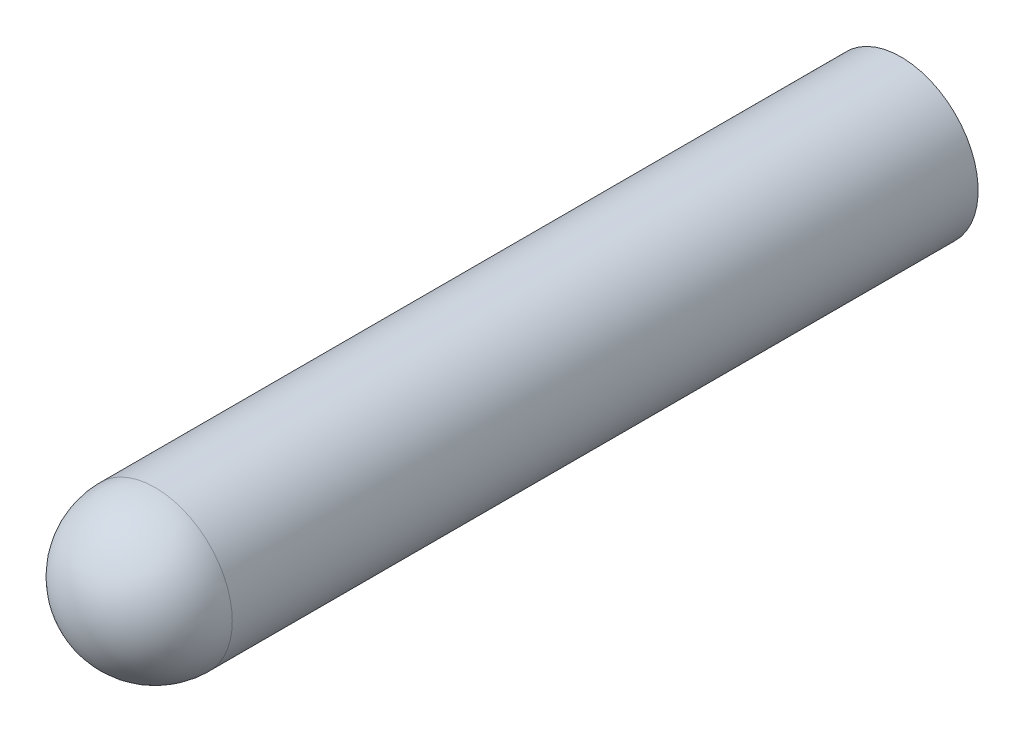
ISO-10303-21;
HEADER;
FILE_DESCRIPTION(('STEP AP214'),'2;1');
FILE_NAME('part.step','',(''),(''),'','','');
FILE_SCHEMA(('AUTOMOTIVE_DESIGN { 1 0 10303 214 1 1 1 1 }'));
ENDSEC;
DATA;
#1=APPLICATION_CONTEXT('core data for automotive mechanical design processes');
#2=APPLICATION_PROTOCOL_DEFINITION('international standard','automotive_design',2000,#1);
#3=PRODUCT_CONTEXT('',#1,'mechanical');
#4=PRODUCT('Part','Part','',(#3));
#5=PRODUCT_RELATED_PRODUCT_CATEGORY('part','',(#4));
#6=PRODUCT_DEFINITION_FORMATION('','',#4);
#7=PRODUCT_DEFINITION_CONTEXT('part definition',#1,'design');
#8=PRODUCT_DEFINITION('design','',#6,#7);
#9=PRODUCT_DEFINITION_SHAPE('','',#8);
#10=(LENGTH_UNIT() NAMED_UNIT(*) SI_UNIT(.MILLI.,.METRE.));
#11=(NAMED_UNIT(*) PLANE_ANGLE_UNIT() SI_UNIT($,.RADIAN.));
#12=(NAMED_UNIT(*) SI_UNIT($,.STERADIAN.) SOLID_ANGLE_UNIT());
#13=UNCERTAINTY_MEASURE_WITH_UNIT(LENGTH_MEASURE(1.E-05),#10,'distance_accuracy_value','');
#14=(GEOMETRIC_REPRESENTATION_CONTEXT(3) GLOBAL_UNCERTAINTY_ASSIGNED_CONTEXT((#13)) GLOBAL_UNIT_ASSIGNED_CONTEXT((#10,
#11,#12)) REPRESENTATION_CONTEXT('',''));
#15=CARTESIAN_POINT('',(0.,0.,0.));
#16=DIRECTION('',(0.,0.,1.));
#17=DIRECTION('',(1.,0.,0.));
#18=AXIS2_PLACEMENT_3D('',#15,#16,#17);
#19=CARTESIAN_POINT('',(0.,0.,14.5));
#20=DIRECTION('',(0.,0.,-1.));
#21=DIRECTION('',(-1.,0.,0.));
#22=AXIS2_PLACEMENT_3D('',#19,#20,#21);
#23=CYLINDRICAL_SURFACE('',#22,1.5);
#24=CARTESIAN_POINT('',(0.,0.,14.5));
#25=DIRECTION('',(0.,0.,1.));
#26=DIRECTION('',(1.,0.,0.));
#27=AXIS2_PLACEMENT_3D('',#24,#25,#26);
#28=CIRCLE('',#27,1.5);
#29=CARTESIAN_POINT('',(-1.5,0.,14.5));
#30=VERTEX_POINT('',#29);
#31=EDGE_CURVE('E10',#30,#30,#28,.T.);
#32=CARTESIAN_POINT('',(0.,0.,0.));
#33=DIRECTION('',(0.,0.,1.));
#34=DIRECTION('',(1.,0.,0.));
#35=AXIS2_PLACEMENT_3D('',#32,#33,#34);
#36=CIRCLE('',#35,1.5);
#37=CARTESIAN_POINT('',(-1.5,0.,0.));
#38=VERTEX_POINT('',#37);
#39=EDGE_CURVE('E40',#38,#38,#36,.T.);
#40=CARTESIAN_POINT('',(-1.5,0.,14.5));
#41=CARTESIAN_POINT('',(-1.5,0.,14.3489583333333));
#42=CARTESIAN_POINT('',(-1.5,0.,14.1979166666667));
#43=CARTESIAN_POINT('',(-1.5,0.,13.8958333333333));
#44=CARTESIAN_POINT('',(-1.5,0.,13.7447916666667));
#45=CARTESIAN_POINT('',(-1.5,0.,13.4427083333333));
#46=CARTESIAN_POINT('',(-1.5,0.,13.2916666666667));
#47=CARTESIAN_POINT('',(-1.5,0.,12.9895833333333));
#48=CARTESIAN_POINT('',(-1.5,0.,12.8385416666667));
#49=CARTESIAN_POINT('',(-1.5,0.,12.5364583333333));
#50=CARTESIAN_POINT('',(-1.5,0.,12.3854166666667));
#51=CARTESIAN_POINT('',(-1.5,0.,12.0833333333333));
#52=CARTESIAN_POINT('',(-1.5,0.,11.9322916666667));
#53=CARTESIAN_POINT('',(-1.5,0.,11.6302083333333));
#54=CARTESIAN_POINT('',(-1.5,0.,11.4791666666667));
#55=CARTESIAN_POINT('',(-1.5,0.,11.1770833333333));
#56=CARTESIAN_POINT('',(-1.5,0.,11.0260416666667));
#57=CARTESIAN_POINT('',(-1.5,0.,10.7239583333333));
#58=CARTESIAN_POINT('',(-1.5,0.,10.5729166666667));
#59=CARTESIAN_POINT('',(-1.5,0.,10.2708333333333));
#60=CARTESIAN_POINT('',(-1.5,0.,10.1197916666667));
#61=CARTESIAN_POINT('',(-1.5,0.,9.81770833333333));
#62=CARTESIAN_POINT('',(-1.5,0.,9.66666666666667));
#63=CARTESIAN_POINT('',(-1.5,0.,9.36458333333333));
#64=CARTESIAN_POINT('',(-1.5,0.,9.21354166666667));
#65=CARTESIAN_POINT('',(-1.5,0.,8.91145833333333));
#66=CARTESIAN_POINT('',(-1.5,0.,8.76041666666667));
#67=CARTESIAN_POINT('',(-1.5,0.,8.45833333333333));
#68=CARTESIAN_POINT('',(-1.5,0.,8.30729166666667));
#69=CARTESIAN_POINT('',(-1.5,0.,8.00520833333333));
#70=CARTESIAN_POINT('',(-1.5,0.,7.85416666666667));
#71=CARTESIAN_POINT('',(-1.5,0.,7.55208333333333));
#72=CARTESIAN_POINT('',(-1.5,0.,7.40104166666667));
#73=CARTESIAN_POINT('',(-1.5,0.,7.09895833333333));
#74=CARTESIAN_POINT('',(-1.5,0.,6.94791666666667));
#75=CARTESIAN_POINT('',(-1.5,0.,6.64583333333333));
#76=CARTESIAN_POINT('',(-1.5,0.,6.49479166666667));
#77=CARTESIAN_POINT('',(-1.5,0.,6.19270833333333));
#78=CARTESIAN_POINT('',(-1.5,0.,6.04166666666667));
#79=CARTESIAN_POINT('',(-1.5,0.,5.73958333333333));
#80=CARTESIAN_POINT('',(-1.5,0.,5.58854166666667));
#81=CARTESIAN_POINT('',(-1.5,0.,5.28645833333333));
#82=CARTESIAN_POINT('',(-1.5,0.,5.13541666666667));
#83=CARTESIAN_POINT('',(-1.5,0.,4.83333333333333));
#84=CARTESIAN_POINT('',(-1.5,0.,4.68229166666667));
#85=CARTESIAN_POINT('',(-1.5,0.,4.38020833333333));
#86=CARTESIAN_POINT('',(-1.5,0.,4.22916666666667));
#87=CARTESIAN_POINT('',(-1.5,0.,3.92708333333333));
#88=CARTESIAN_POINT('',(-1.5,0.,3.77604166666667));
#89=CARTESIAN_POINT('',(-1.5,0.,3.47395833333333));
#90=CARTESIAN_POINT('',(-1.5,0.,3.32291666666667));
#91=CARTESIAN_POINT('',(-1.5,0.,3.02083333333333));
#92=CARTESIAN_POINT('',(-1.5,0.,2.86979166666667));
#93=CARTESIAN_POINT('',(-1.5,0.,2.56770833333333));
#94=CARTESIAN_POINT('',(-1.5,0.,2.41666666666667));
#95=CARTESIAN_POINT('',(-1.5,0.,2.11458333333333));
#96=CARTESIAN_POINT('',(-1.5,0.,1.96354166666667));
#97=CARTESIAN_POINT('',(-1.5,0.,1.66145833333333));
#98=CARTESIAN_POINT('',(-1.5,0.,1.51041666666667));
#99=CARTESIAN_POINT('',(-1.5,0.,1.20833333333333));
#100=CARTESIAN_POINT('',(-1.5,0.,1.05729166666667));
#101=CARTESIAN_POINT('',(-1.5,0.,0.755208333333334));
#102=CARTESIAN_POINT('',(-1.5,0.,0.604166666666667));
#103=CARTESIAN_POINT('',(-1.5,0.,0.302083333333333));
#104=CARTESIAN_POINT('',(-1.5,0.,0.151041666666667));
#105=CARTESIAN_POINT('',(-1.5,0.,0.));
#106=B_SPLINE_CURVE_WITH_KNOTS('',3,(#40,#41,#42,#43,#44,#45,#46,#47,#48,#49,#50,#51,#52,#53,
#54,#55,#56,#57,#58,#59,#60,#61,#62,#63,#64,#65,#66,#67,#68,#69,#70,#71,#72,#73,#74,#75,#76,#77,
#78,#79,#80,#81,#82,#83,#84,#85,#86,#87,#88,#89,#90,#91,#92,#93,#94,#95,#96,#97,#98,#99,#100,
#101,#102,#103,#104,#105),.UNSPECIFIED.,.F.,.F.,(4,2,2,2,2,2,2,2,2,2,2,2,2,2,2,2,2,2,2,2,2,2,2,
2,2,2,2,2,2,2,2,2,4),(0.,0.453124999999999,0.906249999999999,1.359375,1.8125,2.265625,2.71875,
3.171875,3.625,4.078125,4.53125,4.984375,5.4375,5.890625,6.34375,6.796875,7.25,7.703125,8.15625,
8.609375,9.0625,9.515625,9.96875,10.421875,10.875,11.328125,11.78125,12.234375,12.6875,
13.140625,13.59375,14.046875,14.5),.UNSPECIFIED.);
#107=EDGE_CURVE('BSEAM33',#30,#38,#106,.T.);
#108=ORIENTED_EDGE('',*,*,#31,.F.);
#109=ORIENTED_EDGE('',*,*,#39,.T.);
#110=ORIENTED_EDGE('',*,*,#107,.T.);
#111=ORIENTED_EDGE('',*,*,#107,.F.);
#112=EDGE_LOOP('',(#108,#110,#109,#111));
#113=FACE_BOUND('',#112,.T.);
#114=ADVANCED_FACE('F33',(#113),#23,.T.);
#115=CARTESIAN_POINT('',(0.,0.,14.5));
#116=DIRECTION('',(0.,0.,1.));
#117=DIRECTION('',(1.,0.,0.));
#118=AXIS2_PLACEMENT_3D('',#115,#116,#117);
#119=SPHERICAL_SURFACE('',#118,1.5);
#120=ORIENTED_EDGE('',*,*,#31,.T.);
#121=EDGE_LOOP('',(#120));
#122=FACE_BOUND('',#121,.T.);
#123=ADVANCED_FACE('F35',(#122),#119,.T.);
#124=CARTESIAN_POINT('',(0.,0.,0.));
#125=DIRECTION('',(0.,0.,1.));
#126=DIRECTION('',(1.,0.,0.));
#127=AXIS2_PLACEMENT_3D('',#124,#125,#126);
#128=PLANE('',#127);
#129=ORIENTED_EDGE('',*,*,#39,.F.);
#130=EDGE_LOOP('',(#129));
#131=FACE_BOUND('',#130,.T.);
#132=ADVANCED_FACE('F47',(#131),#128,.F.);
#133=CLOSED_SHELL('',(#114,#123,#132));
#134=MANIFOLD_SOLID_BREP('B2',#133);
#135=ADVANCED_BREP_SHAPE_REPRESENTATION('',(#18,#134),#14);
#136=SHAPE_DEFINITION_REPRESENTATION(#9,#135);
ENDSEC;
END-ISO-10303-21;
